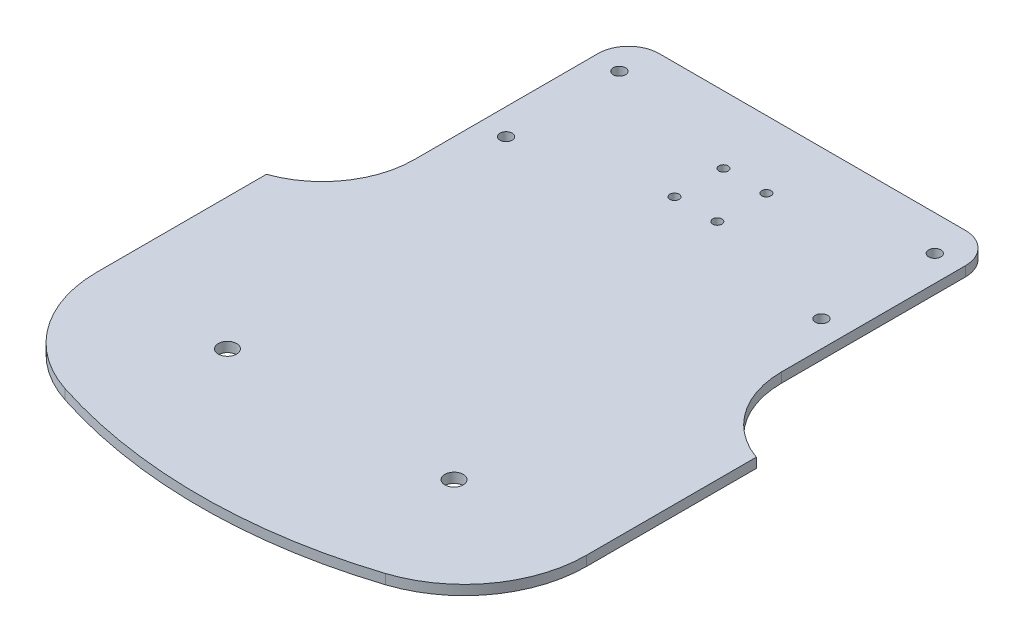
ISO-10303-21;
HEADER;
FILE_DESCRIPTION(('STEP AP214'),'2;1');
FILE_NAME('part.step','',(''),(''),'','','');
FILE_SCHEMA(('AUTOMOTIVE_DESIGN { 1 0 10303 214 1 1 1 1 }'));
ENDSEC;
DATA;
#1=APPLICATION_CONTEXT('core data for automotive mechanical design processes');
#2=APPLICATION_PROTOCOL_DEFINITION('international standard','automotive_design',2000,#1);
#3=PRODUCT_CONTEXT('',#1,'mechanical');
#4=PRODUCT('Part','Part','',(#3));
#5=PRODUCT_RELATED_PRODUCT_CATEGORY('part','',(#4));
#6=PRODUCT_DEFINITION_FORMATION('','',#4);
#7=PRODUCT_DEFINITION_CONTEXT('part definition',#1,'design');
#8=PRODUCT_DEFINITION('design','',#6,#7);
#9=PRODUCT_DEFINITION_SHAPE('','',#8);
#10=(LENGTH_UNIT() NAMED_UNIT(*) SI_UNIT(.MILLI.,.METRE.));
#11=(NAMED_UNIT(*) PLANE_ANGLE_UNIT() SI_UNIT($,.RADIAN.));
#12=(NAMED_UNIT(*) SI_UNIT($,.STERADIAN.) SOLID_ANGLE_UNIT());
#13=UNCERTAINTY_MEASURE_WITH_UNIT(LENGTH_MEASURE(1.E-05),#10,'distance_accuracy_value','');
#14=(GEOMETRIC_REPRESENTATION_CONTEXT(3) GLOBAL_UNCERTAINTY_ASSIGNED_CONTEXT((#13)) GLOBAL_UNIT_ASSIGNED_CONTEXT((#10,
#11,#12)) REPRESENTATION_CONTEXT('',''));
#15=CARTESIAN_POINT('',(0.,0.,0.));
#16=DIRECTION('',(0.,0.,1.));
#17=DIRECTION('',(1.,0.,0.));
#18=AXIS2_PLACEMENT_3D('',#15,#16,#17);
#19=CARTESIAN_POINT('',(20.,0.8,61.8465843842649));
#20=DIRECTION('',(0.,-1.,0.));
#21=DIRECTION('',(0.,0.,-1.));
#22=AXIS2_PLACEMENT_3D('',#19,#20,#21);
#23=CYLINDRICAL_SURFACE('',#22,20.);
#24=CARTESIAN_POINT('',(20.,-0.8,61.8465843842649));
#25=DIRECTION('',(0.,1.,0.));
#26=DIRECTION('',(0.,0.,-1.));
#27=AXIS2_PLACEMENT_3D('',#24,#25,#26);
#28=CIRCLE('',#27,20.);
#29=CARTESIAN_POINT('',(26.1538461538461,-0.8,80.8763026563464));
#30=VERTEX_POINT('',#29);
#31=CARTESIAN_POINT('',(40.,-0.8,61.8465843842649));
#32=VERTEX_POINT('',#31);
#33=EDGE_CURVE('E154',#30,#32,#28,.T.);
#34=ORIENTED_EDGE('',*,*,#33,.T.);
#35=DIRECTION('',(0.,-1.,0.));
#36=VECTOR('',#35,1.);
#37=CARTESIAN_POINT('',(40.,0.8,61.8465843842649));
#38=LINE('',#37,#36);
#39=CARTESIAN_POINT('',(40.,0.8,61.8465843842649));
#40=VERTEX_POINT('',#39);
#41=EDGE_CURVE('E11',#40,#32,#38,.T.);
#42=ORIENTED_EDGE('',*,*,#41,.F.);
#43=CARTESIAN_POINT('',(20.,0.8,61.8465843842649));
#44=DIRECTION('',(0.,1.,0.));
#45=DIRECTION('',(0.,0.,-1.));
#46=AXIS2_PLACEMENT_3D('',#43,#44,#45);
#47=CIRCLE('',#46,20.);
#48=CARTESIAN_POINT('',(26.1538461538461,0.8,80.8763026563464));
#49=VERTEX_POINT('',#48);
#50=EDGE_CURVE('E177',#49,#40,#47,.T.);
#51=ORIENTED_EDGE('',*,*,#50,.F.);
#52=DIRECTION('',(0.,-1.,0.));
#53=VECTOR('',#52,1.);
#54=CARTESIAN_POINT('',(26.1538461538461,0.8,80.8763026563464));
#55=LINE('',#54,#53);
#56=EDGE_CURVE('E150',#49,#30,#55,.T.);
#57=ORIENTED_EDGE('',*,*,#56,.T.);
#58=EDGE_LOOP('',(#34,#42,#51,#57));
#59=FACE_BOUND('',#58,.T.);
#60=ADVANCED_FACE('F34',(#59),#23,.T.);
#61=CARTESIAN_POINT('',(40.,0.8,61.8465843842649));
#62=DIRECTION('',(-1.,0.,0.));
#63=DIRECTION('',(0.,0.,1.));
#64=AXIS2_PLACEMENT_3D('',#61,#62,#63);
#65=PLANE('',#64);
#66=DIRECTION('',(0.,0.,-1.));
#67=VECTOR('',#66,1.);
#68=CARTESIAN_POINT('',(40.,-0.8,61.8465843842649));
#69=LINE('',#68,#67);
#70=CARTESIAN_POINT('',(40.,-0.8,34.142135623731));
#71=VERTEX_POINT('',#70);
#72=EDGE_CURVE('E157',#32,#71,#69,.T.);
#73=ORIENTED_EDGE('',*,*,#72,.T.);
#74=DIRECTION('',(0.,-1.,0.));
#75=VECTOR('',#74,1.);
#76=CARTESIAN_POINT('',(40.,0.8,34.142135623731));
#77=LINE('',#76,#75);
#78=CARTESIAN_POINT('',(40.,0.8,34.142135623731));
#79=VERTEX_POINT('',#78);
#80=EDGE_CURVE('E42',#79,#71,#77,.T.);
#81=ORIENTED_EDGE('',*,*,#80,.F.);
#82=DIRECTION('',(0.,0.,-1.));
#83=VECTOR('',#82,1.);
#84=CARTESIAN_POINT('',(40.,0.8,61.8465843842649));
#85=LINE('',#84,#83);
#86=EDGE_CURVE('E105',#40,#79,#85,.T.);
#87=ORIENTED_EDGE('',*,*,#86,.F.);
#88=ORIENTED_EDGE('',*,*,#41,.T.);
#89=EDGE_LOOP('',(#73,#81,#87,#88));
#90=FACE_BOUND('',#89,.T.);
#91=ADVANCED_FACE('F256',(#90),#65,.F.);
#92=CARTESIAN_POINT('',(45.,0.8,20.));
#93=DIRECTION('',(0.,-1.,0.));
#94=DIRECTION('',(0.,0.,-1.));
#95=AXIS2_PLACEMENT_3D('',#92,#93,#94);
#96=CYLINDRICAL_SURFACE('',#95,15.);
#97=CARTESIAN_POINT('',(45.,-0.8,20.));
#98=DIRECTION('',(0.,-1.,0.));
#99=DIRECTION('',(0.,0.,1.));
#100=AXIS2_PLACEMENT_3D('',#97,#98,#99);
#101=CIRCLE('',#100,15.);
#102=CARTESIAN_POINT('',(30.,-0.8,20.));
#103=VERTEX_POINT('',#102);
#104=EDGE_CURVE('E160',#71,#103,#101,.T.);
#105=ORIENTED_EDGE('',*,*,#104,.T.);
#106=DIRECTION('',(0.,-1.,0.));
#107=VECTOR('',#106,1.);
#108=CARTESIAN_POINT('',(30.,0.8,20.));
#109=LINE('',#108,#107);
#110=CARTESIAN_POINT('',(30.,0.8,20.));
#111=VERTEX_POINT('',#110);
#112=EDGE_CURVE('E196',#111,#103,#109,.T.);
#113=ORIENTED_EDGE('',*,*,#112,.F.);
#114=CARTESIAN_POINT('',(45.,0.8,20.));
#115=DIRECTION('',(0.,-1.,0.));
#116=DIRECTION('',(0.,0.,1.));
#117=AXIS2_PLACEMENT_3D('',#114,#115,#116);
#118=CIRCLE('',#117,15.);
#119=EDGE_CURVE('E204',#79,#111,#118,.T.);
#120=ORIENTED_EDGE('',*,*,#119,.F.);
#121=ORIENTED_EDGE('',*,*,#80,.T.);
#122=EDGE_LOOP('',(#105,#113,#120,#121));
#123=FACE_BOUND('',#122,.T.);
#124=ADVANCED_FACE('F202',(#123),#96,.F.);
#125=CARTESIAN_POINT('',(30.,0.8,-9.99999999999999));
#126=DIRECTION('',(-1.,0.,0.));
#127=DIRECTION('',(0.,0.,1.));
#128=AXIS2_PLACEMENT_3D('',#125,#126,#127);
#129=PLANE('',#128);
#130=DIRECTION('',(0.,0.,-1.));
#131=VECTOR('',#130,1.);
#132=CARTESIAN_POINT('',(30.,-0.8,-9.99999999999999));
#133=LINE('',#132,#131);
#134=CARTESIAN_POINT('',(30.,-0.8,-9.99999999999999));
#135=VERTEX_POINT('',#134);
#136=EDGE_CURVE('E162',#103,#135,#133,.T.);
#137=ORIENTED_EDGE('',*,*,#136,.T.);
#138=DIRECTION('',(0.,-1.,0.));
#139=VECTOR('',#138,1.);
#140=CARTESIAN_POINT('',(30.,0.8,-9.99999999999999));
#141=LINE('',#140,#139);
#142=CARTESIAN_POINT('',(30.,0.8,-9.99999999999999));
#143=VERTEX_POINT('',#142);
#144=EDGE_CURVE('E193',#143,#135,#141,.T.);
#145=ORIENTED_EDGE('',*,*,#144,.F.);
#146=DIRECTION('',(0.,0.,-1.));
#147=VECTOR('',#146,1.);
#148=CARTESIAN_POINT('',(30.,0.8,-9.99999999999999));
#149=LINE('',#148,#147);
#150=EDGE_CURVE('E222',#111,#143,#149,.T.);
#151=ORIENTED_EDGE('',*,*,#150,.F.);
#152=ORIENTED_EDGE('',*,*,#112,.T.);
#153=EDGE_LOOP('',(#137,#145,#151,#152));
#154=FACE_BOUND('',#153,.T.);
#155=ADVANCED_FACE('F213',(#154),#129,.F.);
#156=CARTESIAN_POINT('',(25.,0.8,-9.99999999999999));
#157=DIRECTION('',(0.,-1.,0.));
#158=DIRECTION('',(0.,0.,-1.));
#159=AXIS2_PLACEMENT_3D('',#156,#157,#158);
#160=CYLINDRICAL_SURFACE('',#159,5.);
#161=CARTESIAN_POINT('',(25.,-0.8,-9.99999999999999));
#162=DIRECTION('',(0.,1.,0.));
#163=DIRECTION('',(0.,0.,-1.));
#164=AXIS2_PLACEMENT_3D('',#161,#162,#163);
#165=CIRCLE('',#164,5.);
#166=CARTESIAN_POINT('',(25.,-0.8,-15.));
#167=VERTEX_POINT('',#166);
#168=EDGE_CURVE('E164',#135,#167,#165,.T.);
#169=ORIENTED_EDGE('',*,*,#168,.T.);
#170=DIRECTION('',(0.,-1.,0.));
#171=VECTOR('',#170,1.);
#172=CARTESIAN_POINT('',(25.,0.8,-15.));
#173=LINE('',#172,#171);
#174=CARTESIAN_POINT('',(25.,0.8,-15.));
#175=VERTEX_POINT('',#174);
#176=EDGE_CURVE('E190',#175,#167,#173,.T.);
#177=ORIENTED_EDGE('',*,*,#176,.F.);
#178=CARTESIAN_POINT('',(25.,0.8,-9.99999999999999));
#179=DIRECTION('',(0.,1.,0.));
#180=DIRECTION('',(0.,0.,-1.));
#181=AXIS2_PLACEMENT_3D('',#178,#179,#180);
#182=CIRCLE('',#181,5.);
#183=EDGE_CURVE('E219',#143,#175,#182,.T.);
#184=ORIENTED_EDGE('',*,*,#183,.F.);
#185=ORIENTED_EDGE('',*,*,#144,.T.);
#186=EDGE_LOOP('',(#169,#177,#184,#185));
#187=FACE_BOUND('',#186,.T.);
#188=ADVANCED_FACE('F217',(#187),#160,.T.);
#189=CARTESIAN_POINT('',(-25.,0.8,-15.));
#190=DIRECTION('',(0.,0.,1.));
#191=DIRECTION('',(1.,0.,0.));
#192=AXIS2_PLACEMENT_3D('',#189,#190,#191);
#193=PLANE('',#192);
#194=DIRECTION('',(-1.,0.,0.));
#195=VECTOR('',#194,1.);
#196=CARTESIAN_POINT('',(-25.,-0.8,-15.));
#197=LINE('',#196,#195);
#198=CARTESIAN_POINT('',(-25.,-0.8,-15.));
#199=VERTEX_POINT('',#198);
#200=EDGE_CURVE('E166',#167,#199,#197,.T.);
#201=ORIENTED_EDGE('',*,*,#200,.T.);
#202=DIRECTION('',(0.,-1.,0.));
#203=VECTOR('',#202,1.);
#204=CARTESIAN_POINT('',(-25.,0.8,-15.));
#205=LINE('',#204,#203);
#206=CARTESIAN_POINT('',(-25.,0.8,-15.));
#207=VERTEX_POINT('',#206);
#208=EDGE_CURVE('E187',#207,#199,#205,.T.);
#209=ORIENTED_EDGE('',*,*,#208,.F.);
#210=DIRECTION('',(-1.,0.,0.));
#211=VECTOR('',#210,1.);
#212=CARTESIAN_POINT('',(-25.,0.8,-15.));
#213=LINE('',#212,#211);
#214=EDGE_CURVE('E221',#175,#207,#213,.T.);
#215=ORIENTED_EDGE('',*,*,#214,.F.);
#216=ORIENTED_EDGE('',*,*,#176,.T.);
#217=EDGE_LOOP('',(#201,#209,#215,#216));
#218=FACE_BOUND('',#217,.T.);
#219=ADVANCED_FACE('F269',(#218),#193,.F.);
#220=CARTESIAN_POINT('',(-25.,0.8,-9.99999999999999));
#221=DIRECTION('',(0.,-1.,0.));
#222=DIRECTION('',(0.,0.,-1.));
#223=AXIS2_PLACEMENT_3D('',#220,#221,#222);
#224=CYLINDRICAL_SURFACE('',#223,5.);
#225=CARTESIAN_POINT('',(-25.,-0.8,-9.99999999999999));
#226=DIRECTION('',(0.,1.,0.));
#227=DIRECTION('',(0.,0.,1.));
#228=AXIS2_PLACEMENT_3D('',#225,#226,#227);
#229=CIRCLE('',#228,5.);
#230=CARTESIAN_POINT('',(-30.,-0.8,-10.));
#231=VERTEX_POINT('',#230);
#232=EDGE_CURVE('E168',#199,#231,#229,.T.);
#233=ORIENTED_EDGE('',*,*,#232,.T.);
#234=DIRECTION('',(0.,-1.,0.));
#235=VECTOR('',#234,1.);
#236=CARTESIAN_POINT('',(-30.,0.8,-10.));
#237=LINE('',#236,#235);
#238=CARTESIAN_POINT('',(-30.,0.8,-10.));
#239=VERTEX_POINT('',#238);
#240=EDGE_CURVE('E184',#239,#231,#237,.T.);
#241=ORIENTED_EDGE('',*,*,#240,.F.);
#242=CARTESIAN_POINT('',(-25.,0.8,-9.99999999999999));
#243=DIRECTION('',(0.,1.,0.));
#244=DIRECTION('',(0.,0.,1.));
#245=AXIS2_PLACEMENT_3D('',#242,#243,#244);
#246=CIRCLE('',#245,5.);
#247=EDGE_CURVE('E224',#207,#239,#246,.T.);
#248=ORIENTED_EDGE('',*,*,#247,.F.);
#249=ORIENTED_EDGE('',*,*,#208,.T.);
#250=EDGE_LOOP('',(#233,#241,#248,#249));
#251=FACE_BOUND('',#250,.T.);
#252=ADVANCED_FACE('F272',(#251),#224,.T.);
#253=CARTESIAN_POINT('',(-30.,0.8,-9.99999999999999));
#254=DIRECTION('',(1.,0.,0.));
#255=DIRECTION('',(0.,0.,-1.));
#256=AXIS2_PLACEMENT_3D('',#253,#254,#255);
#257=PLANE('',#256);
#258=DIRECTION('',(0.,0.,1.));
#259=VECTOR('',#258,1.);
#260=CARTESIAN_POINT('',(-30.,-0.8,-9.99999999999999));
#261=LINE('',#260,#259);
#262=CARTESIAN_POINT('',(-30.,-0.8,20.));
#263=VERTEX_POINT('',#262);
#264=EDGE_CURVE('E170',#231,#263,#261,.T.);
#265=ORIENTED_EDGE('',*,*,#264,.T.);
#266=DIRECTION('',(0.,-1.,0.));
#267=VECTOR('',#266,1.);
#268=CARTESIAN_POINT('',(-30.,0.8,20.));
#269=LINE('',#268,#267);
#270=CARTESIAN_POINT('',(-30.,0.8,20.));
#271=VERTEX_POINT('',#270);
#272=EDGE_CURVE('E181',#271,#263,#269,.T.);
#273=ORIENTED_EDGE('',*,*,#272,.F.);
#274=DIRECTION('',(0.,0.,1.));
#275=VECTOR('',#274,1.);
#276=CARTESIAN_POINT('',(-30.,0.8,-9.99999999999999));
#277=LINE('',#276,#275);
#278=EDGE_CURVE('E230',#239,#271,#277,.T.);
#279=ORIENTED_EDGE('',*,*,#278,.F.);
#280=ORIENTED_EDGE('',*,*,#240,.T.);
#281=EDGE_LOOP('',(#265,#273,#279,#280));
#282=FACE_BOUND('',#281,.T.);
#283=ADVANCED_FACE('F236',(#282),#257,.F.);
#284=CARTESIAN_POINT('',(-45.,0.8,20.));
#285=DIRECTION('',(0.,-1.,0.));
#286=DIRECTION('',(0.,0.,-1.));
#287=AXIS2_PLACEMENT_3D('',#284,#285,#286);
#288=CYLINDRICAL_SURFACE('',#287,15.);
#289=CARTESIAN_POINT('',(-45.,-0.8,20.));
#290=DIRECTION('',(0.,-1.,0.));
#291=DIRECTION('',(0.,0.,-1.));
#292=AXIS2_PLACEMENT_3D('',#289,#290,#291);
#293=CIRCLE('',#292,15.);
#294=CARTESIAN_POINT('',(-40.,-0.8,34.142135623731));
#295=VERTEX_POINT('',#294);
#296=EDGE_CURVE('E172',#263,#295,#293,.T.);
#297=ORIENTED_EDGE('',*,*,#296,.T.);
#298=DIRECTION('',(0.,-1.,0.));
#299=VECTOR('',#298,1.);
#300=CARTESIAN_POINT('',(-40.,0.8,34.142135623731));
#301=LINE('',#300,#299);
#302=CARTESIAN_POINT('',(-40.,0.8,34.142135623731));
#303=VERTEX_POINT('',#302);
#304=EDGE_CURVE('E145',#303,#295,#301,.T.);
#305=ORIENTED_EDGE('',*,*,#304,.F.);
#306=CARTESIAN_POINT('',(-45.,0.8,20.));
#307=DIRECTION('',(0.,-1.,0.));
#308=DIRECTION('',(0.,0.,-1.));
#309=AXIS2_PLACEMENT_3D('',#306,#307,#308);
#310=CIRCLE('',#309,15.);
#311=EDGE_CURVE('E136',#271,#303,#310,.T.);
#312=ORIENTED_EDGE('',*,*,#311,.F.);
#313=ORIENTED_EDGE('',*,*,#272,.T.);
#314=EDGE_LOOP('',(#297,#305,#312,#313));
#315=FACE_BOUND('',#314,.T.);
#316=ADVANCED_FACE('F240',(#315),#288,.F.);
#317=CARTESIAN_POINT('',(-40.,0.8,61.8465843842649));
#318=DIRECTION('',(1.,0.,0.));
#319=DIRECTION('',(0.,0.,-1.));
#320=AXIS2_PLACEMENT_3D('',#317,#318,#319);
#321=PLANE('',#320);
#322=DIRECTION('',(0.,0.,1.));
#323=VECTOR('',#322,1.);
#324=CARTESIAN_POINT('',(-40.,-0.8,61.8465843842649));
#325=LINE('',#324,#323);
#326=CARTESIAN_POINT('',(-40.,-0.8,61.8465843842649));
#327=VERTEX_POINT('',#326);
#328=EDGE_CURVE('E144',#295,#327,#325,.T.);
#329=ORIENTED_EDGE('',*,*,#328,.T.);
#330=DIRECTION('',(0.,-1.,0.));
#331=VECTOR('',#330,1.);
#332=CARTESIAN_POINT('',(-40.,0.8,61.8465843842649));
#333=LINE('',#332,#331);
#334=CARTESIAN_POINT('',(-40.,0.8,61.8465843842649));
#335=VERTEX_POINT('',#334);
#336=EDGE_CURVE('E141',#335,#327,#333,.T.);
#337=ORIENTED_EDGE('',*,*,#336,.F.);
#338=DIRECTION('',(0.,0.,1.));
#339=VECTOR('',#338,1.);
#340=CARTESIAN_POINT('',(-40.,0.8,61.8465843842649));
#341=LINE('',#340,#339);
#342=EDGE_CURVE('E130',#303,#335,#341,.T.);
#343=ORIENTED_EDGE('',*,*,#342,.F.);
#344=ORIENTED_EDGE('',*,*,#304,.T.);
#345=EDGE_LOOP('',(#329,#337,#343,#344));
#346=FACE_BOUND('',#345,.T.);
#347=ADVANCED_FACE('F142',(#346),#321,.F.);
#348=CARTESIAN_POINT('',(-20.,0.8,61.8465843842649));
#349=DIRECTION('',(0.,-1.,0.));
#350=DIRECTION('',(0.,0.,-1.));
#351=AXIS2_PLACEMENT_3D('',#348,#349,#350);
#352=CYLINDRICAL_SURFACE('',#351,20.);
#353=CARTESIAN_POINT('',(-20.,-0.8,61.8465843842649));
#354=DIRECTION('',(0.,1.,0.));
#355=DIRECTION('',(0.,0.,-1.));
#356=AXIS2_PLACEMENT_3D('',#353,#354,#355);
#357=CIRCLE('',#356,20.);
#358=CARTESIAN_POINT('',(-26.1538461538461,-0.8,80.8763026563464));
#359=VERTEX_POINT('',#358);
#360=EDGE_CURVE('E91',#327,#359,#357,.T.);
#361=ORIENTED_EDGE('',*,*,#360,.T.);
#362=DIRECTION('',(0.,-1.,0.));
#363=VECTOR('',#362,1.);
#364=CARTESIAN_POINT('',(-26.1538461538461,0.8,80.8763026563464));
#365=LINE('',#364,#363);
#366=CARTESIAN_POINT('',(-26.1538461538461,0.8,80.8763026563464));
#367=VERTEX_POINT('',#366);
#368=EDGE_CURVE('E146',#367,#359,#365,.T.);
#369=ORIENTED_EDGE('',*,*,#368,.F.);
#370=CARTESIAN_POINT('',(-20.,0.8,61.8465843842649));
#371=DIRECTION('',(0.,1.,0.));
#372=DIRECTION('',(0.,0.,-1.));
#373=AXIS2_PLACEMENT_3D('',#370,#371,#372);
#374=CIRCLE('',#373,20.);
#375=EDGE_CURVE('E134',#335,#367,#374,.T.);
#376=ORIENTED_EDGE('',*,*,#375,.F.);
#377=ORIENTED_EDGE('',*,*,#336,.T.);
#378=EDGE_LOOP('',(#361,#369,#376,#377));
#379=FACE_BOUND('',#378,.T.);
#380=ADVANCED_FACE('F148',(#379),#352,.T.);
#381=CARTESIAN_POINT('',(0.,0.8,0.));
#382=DIRECTION('',(0.,-1.,0.));
#383=DIRECTION('',(0.,0.,-1.));
#384=AXIS2_PLACEMENT_3D('',#381,#382,#383);
#385=CYLINDRICAL_SURFACE('',#384,85.);
#386=CARTESIAN_POINT('',(0.,-0.8,0.));
#387=DIRECTION('',(0.,1.,0.));
#388=DIRECTION('',(0.,0.,-1.));
#389=AXIS2_PLACEMENT_3D('',#386,#387,#388);
#390=CIRCLE('',#389,85.);
#391=EDGE_CURVE('E97',#359,#30,#390,.T.);
#392=ORIENTED_EDGE('',*,*,#391,.T.);
#393=ORIENTED_EDGE('',*,*,#56,.F.);
#394=CARTESIAN_POINT('',(0.,0.8,0.));
#395=DIRECTION('',(0.,1.,0.));
#396=DIRECTION('',(0.,0.,-1.));
#397=AXIS2_PLACEMENT_3D('',#394,#395,#396);
#398=CIRCLE('',#397,85.);
#399=EDGE_CURVE('E50',#367,#49,#398,.T.);
#400=ORIENTED_EDGE('',*,*,#399,.F.);
#401=ORIENTED_EDGE('',*,*,#368,.T.);
#402=EDGE_LOOP('',(#392,#393,#400,#401));
#403=FACE_BOUND('',#402,.T.);
#404=ADVANCED_FACE('F244',(#403),#385,.T.);
#405=CARTESIAN_POINT('',(20.,0.8,61.8465843842649));
#406=DIRECTION('',(0.,-1.,0.));
#407=DIRECTION('',(0.,0.,-1.));
#408=AXIS2_PLACEMENT_3D('',#405,#406,#407);
#409=PLANE('',#408);
#410=CARTESIAN_POINT('',(-18.5,0.8,62.0000000000001));
#411=DIRECTION('',(0.,-1.,0.));
#412=DIRECTION('',(0.,0.,-1.));
#413=AXIS2_PLACEMENT_3D('',#410,#411,#412);
#414=CIRCLE('',#413,1.5);
#415=CARTESIAN_POINT('',(-18.5,0.8,60.5000000000001));
#416=VERTEX_POINT('',#415);
#417=EDGE_CURVE('E416',#416,#416,#414,.T.);
#418=ORIENTED_EDGE('',*,*,#417,.T.);
#419=EDGE_LOOP('',(#418));
#420=FACE_BOUND('',#419,.T.);
#421=CARTESIAN_POINT('',(18.5,0.8,62.0000000000001));
#422=DIRECTION('',(0.,-1.,0.));
#423=DIRECTION('',(0.,0.,-1.));
#424=AXIS2_PLACEMENT_3D('',#421,#422,#423);
#425=CIRCLE('',#424,1.49999999999999);
#426=CARTESIAN_POINT('',(18.5,0.8,60.5000000000001));
#427=VERTEX_POINT('',#426);
#428=EDGE_CURVE('E424',#427,#427,#425,.T.);
#429=ORIENTED_EDGE('',*,*,#428,.T.);
#430=EDGE_LOOP('',(#429));
#431=FACE_BOUND('',#430,.T.);
#432=CARTESIAN_POINT('',(3.5,0.8,-4.));
#433=DIRECTION('',(0.,-1.,0.));
#434=DIRECTION('',(0.,0.,-1.));
#435=AXIS2_PLACEMENT_3D('',#432,#433,#434);
#436=CIRCLE('',#435,0.750000000000001);
#437=CARTESIAN_POINT('',(3.5,0.8,-4.75));
#438=VERTEX_POINT('',#437);
#439=EDGE_CURVE('E430',#438,#438,#436,.T.);
#440=ORIENTED_EDGE('',*,*,#439,.T.);
#441=EDGE_LOOP('',(#440));
#442=FACE_BOUND('',#441,.T.);
#443=CARTESIAN_POINT('',(-3.5,0.8,-4.));
#444=DIRECTION('',(0.,-1.,0.));
#445=DIRECTION('',(0.,0.,-1.));
#446=AXIS2_PLACEMENT_3D('',#443,#444,#445);
#447=CIRCLE('',#446,0.75);
#448=CARTESIAN_POINT('',(-3.5,0.8,-4.75));
#449=VERTEX_POINT('',#448);
#450=EDGE_CURVE('E436',#449,#449,#447,.T.);
#451=ORIENTED_EDGE('',*,*,#450,.T.);
#452=EDGE_LOOP('',(#451));
#453=FACE_BOUND('',#452,.T.);
#454=CARTESIAN_POINT('',(3.5,0.8,4.));
#455=DIRECTION('',(0.,-1.,0.));
#456=DIRECTION('',(0.,0.,-1.));
#457=AXIS2_PLACEMENT_3D('',#454,#455,#456);
#458=CIRCLE('',#457,0.750000000000001);
#459=CARTESIAN_POINT('',(3.5,0.8,3.25));
#460=VERTEX_POINT('',#459);
#461=EDGE_CURVE('E442',#460,#460,#458,.T.);
#462=ORIENTED_EDGE('',*,*,#461,.T.);
#463=EDGE_LOOP('',(#462));
#464=FACE_BOUND('',#463,.T.);
#465=CARTESIAN_POINT('',(-3.5,0.8,4.));
#466=DIRECTION('',(0.,-1.,0.));
#467=DIRECTION('',(0.,0.,-1.));
#468=AXIS2_PLACEMENT_3D('',#465,#466,#467);
#469=CIRCLE('',#468,0.75);
#470=CARTESIAN_POINT('',(-3.5,0.8,3.25));
#471=VERTEX_POINT('',#470);
#472=EDGE_CURVE('E448',#471,#471,#469,.T.);
#473=ORIENTED_EDGE('',*,*,#472,.T.);
#474=EDGE_LOOP('',(#473));
#475=FACE_BOUND('',#474,.T.);
#476=CARTESIAN_POINT('',(25.75,0.8,-9.24999999999997));
#477=DIRECTION('',(0.,-1.,0.));
#478=DIRECTION('',(0.,0.,-1.));
#479=AXIS2_PLACEMENT_3D('',#476,#477,#478);
#480=CIRCLE('',#479,0.999999999999998);
#481=CARTESIAN_POINT('',(25.75,0.8,-10.25));
#482=VERTEX_POINT('',#481);
#483=EDGE_CURVE('E454',#482,#482,#480,.T.);
#484=ORIENTED_EDGE('',*,*,#483,.T.);
#485=EDGE_LOOP('',(#484));
#486=FACE_BOUND('',#485,.T.);
#487=CARTESIAN_POINT('',(25.75,0.8,9.25000000000003));
#488=DIRECTION('',(0.,-1.,0.));
#489=DIRECTION('',(0.,0.,-1.));
#490=AXIS2_PLACEMENT_3D('',#487,#488,#489);
#491=CIRCLE('',#490,1.);
#492=CARTESIAN_POINT('',(25.75,0.8,8.25000000000002));
#493=VERTEX_POINT('',#492);
#494=EDGE_CURVE('E460',#493,#493,#491,.T.);
#495=ORIENTED_EDGE('',*,*,#494,.T.);
#496=EDGE_LOOP('',(#495));
#497=FACE_BOUND('',#496,.T.);
#498=CARTESIAN_POINT('',(-25.75,0.8,9.25));
#499=DIRECTION('',(0.,-1.,0.));
#500=DIRECTION('',(0.,0.,-1.));
#501=AXIS2_PLACEMENT_3D('',#498,#499,#500);
#502=CIRCLE('',#501,1.);
#503=CARTESIAN_POINT('',(-25.75,0.8,8.25));
#504=VERTEX_POINT('',#503);
#505=EDGE_CURVE('E466',#504,#504,#502,.T.);
#506=ORIENTED_EDGE('',*,*,#505,.T.);
#507=EDGE_LOOP('',(#506));
#508=FACE_BOUND('',#507,.T.);
#509=CARTESIAN_POINT('',(-25.75,0.8,-9.25));
#510=DIRECTION('',(0.,-1.,0.));
#511=DIRECTION('',(0.,0.,-1.));
#512=AXIS2_PLACEMENT_3D('',#509,#510,#511);
#513=CIRCLE('',#512,1.);
#514=CARTESIAN_POINT('',(-25.75,0.8,-10.25));
#515=VERTEX_POINT('',#514);
#516=EDGE_CURVE('E158',#515,#515,#513,.T.);
#517=ORIENTED_EDGE('',*,*,#516,.T.);
#518=EDGE_LOOP('',(#517));
#519=FACE_BOUND('',#518,.T.);
#520=ORIENTED_EDGE('',*,*,#50,.T.);
#521=ORIENTED_EDGE('',*,*,#86,.T.);
#522=ORIENTED_EDGE('',*,*,#119,.T.);
#523=ORIENTED_EDGE('',*,*,#150,.T.);
#524=ORIENTED_EDGE('',*,*,#183,.T.);
#525=ORIENTED_EDGE('',*,*,#214,.T.);
#526=ORIENTED_EDGE('',*,*,#247,.T.);
#527=ORIENTED_EDGE('',*,*,#278,.T.);
#528=ORIENTED_EDGE('',*,*,#311,.T.);
#529=ORIENTED_EDGE('',*,*,#342,.T.);
#530=ORIENTED_EDGE('',*,*,#375,.T.);
#531=ORIENTED_EDGE('',*,*,#399,.T.);
#532=EDGE_LOOP('',(#520,#521,#522,#523,#524,#525,#526,#527,#528,#529,#530,#531));
#533=FACE_BOUND('',#532,.T.);
#534=ADVANCED_FACE('F132',(#420,#431,#442,#453,#464,#475,#486,#497,#508,#519,#533),#409,.F.);
#535=CARTESIAN_POINT('',(20.,-0.8,61.8465843842649));
#536=DIRECTION('',(0.,-1.,0.));
#537=DIRECTION('',(0.,0.,-1.));
#538=AXIS2_PLACEMENT_3D('',#535,#536,#537);
#539=PLANE('',#538);
#540=CARTESIAN_POINT('',(-18.5,-0.8,62.0000000000001));
#541=DIRECTION('',(0.,-1.,0.));
#542=DIRECTION('',(0.,0.,-1.));
#543=AXIS2_PLACEMENT_3D('',#540,#541,#542);
#544=CIRCLE('',#543,1.5);
#545=CARTESIAN_POINT('',(-18.5,-0.8,60.5000000000001));
#546=VERTEX_POINT('',#545);
#547=EDGE_CURVE('E419',#546,#546,#544,.T.);
#548=ORIENTED_EDGE('',*,*,#547,.F.);
#549=EDGE_LOOP('',(#548));
#550=FACE_BOUND('',#549,.T.);
#551=CARTESIAN_POINT('',(18.5,-0.8,62.0000000000001));
#552=DIRECTION('',(0.,-1.,0.));
#553=DIRECTION('',(0.,0.,-1.));
#554=AXIS2_PLACEMENT_3D('',#551,#552,#553);
#555=CIRCLE('',#554,1.49999999999999);
#556=CARTESIAN_POINT('',(18.5,-0.8,60.5000000000001));
#557=VERTEX_POINT('',#556);
#558=EDGE_CURVE('E421',#557,#557,#555,.T.);
#559=ORIENTED_EDGE('',*,*,#558,.F.);
#560=EDGE_LOOP('',(#559));
#561=FACE_BOUND('',#560,.T.);
#562=CARTESIAN_POINT('',(3.5,-0.8,-4.));
#563=DIRECTION('',(0.,-1.,0.));
#564=DIRECTION('',(0.,0.,-1.));
#565=AXIS2_PLACEMENT_3D('',#562,#563,#564);
#566=CIRCLE('',#565,0.750000000000001);
#567=CARTESIAN_POINT('',(3.5,-0.8,-4.75));
#568=VERTEX_POINT('',#567);
#569=EDGE_CURVE('E427',#568,#568,#566,.T.);
#570=ORIENTED_EDGE('',*,*,#569,.F.);
#571=EDGE_LOOP('',(#570));
#572=FACE_BOUND('',#571,.T.);
#573=CARTESIAN_POINT('',(-3.5,-0.8,-4.));
#574=DIRECTION('',(0.,-1.,0.));
#575=DIRECTION('',(0.,0.,-1.));
#576=AXIS2_PLACEMENT_3D('',#573,#574,#575);
#577=CIRCLE('',#576,0.75);
#578=CARTESIAN_POINT('',(-3.5,-0.8,-4.75));
#579=VERTEX_POINT('',#578);
#580=EDGE_CURVE('E433',#579,#579,#577,.T.);
#581=ORIENTED_EDGE('',*,*,#580,.F.);
#582=EDGE_LOOP('',(#581));
#583=FACE_BOUND('',#582,.T.);
#584=CARTESIAN_POINT('',(3.5,-0.8,4.));
#585=DIRECTION('',(0.,-1.,0.));
#586=DIRECTION('',(0.,0.,-1.));
#587=AXIS2_PLACEMENT_3D('',#584,#585,#586);
#588=CIRCLE('',#587,0.750000000000001);
#589=CARTESIAN_POINT('',(3.5,-0.8,3.25));
#590=VERTEX_POINT('',#589);
#591=EDGE_CURVE('E439',#590,#590,#588,.T.);
#592=ORIENTED_EDGE('',*,*,#591,.F.);
#593=EDGE_LOOP('',(#592));
#594=FACE_BOUND('',#593,.T.);
#595=CARTESIAN_POINT('',(-3.5,-0.8,4.));
#596=DIRECTION('',(0.,-1.,0.));
#597=DIRECTION('',(0.,0.,-1.));
#598=AXIS2_PLACEMENT_3D('',#595,#596,#597);
#599=CIRCLE('',#598,0.75);
#600=CARTESIAN_POINT('',(-3.5,-0.8,3.25));
#601=VERTEX_POINT('',#600);
#602=EDGE_CURVE('E445',#601,#601,#599,.T.);
#603=ORIENTED_EDGE('',*,*,#602,.F.);
#604=EDGE_LOOP('',(#603));
#605=FACE_BOUND('',#604,.T.);
#606=CARTESIAN_POINT('',(25.75,-0.8,-9.24999999999997));
#607=DIRECTION('',(0.,-1.,0.));
#608=DIRECTION('',(0.,0.,-1.));
#609=AXIS2_PLACEMENT_3D('',#606,#607,#608);
#610=CIRCLE('',#609,0.999999999999998);
#611=CARTESIAN_POINT('',(25.75,-0.8,-10.25));
#612=VERTEX_POINT('',#611);
#613=EDGE_CURVE('E451',#612,#612,#610,.T.);
#614=ORIENTED_EDGE('',*,*,#613,.F.);
#615=EDGE_LOOP('',(#614));
#616=FACE_BOUND('',#615,.T.);
#617=CARTESIAN_POINT('',(25.75,-0.8,9.25000000000003));
#618=DIRECTION('',(0.,-1.,0.));
#619=DIRECTION('',(0.,0.,-1.));
#620=AXIS2_PLACEMENT_3D('',#617,#618,#619);
#621=CIRCLE('',#620,1.);
#622=CARTESIAN_POINT('',(25.75,-0.8,8.25000000000002));
#623=VERTEX_POINT('',#622);
#624=EDGE_CURVE('E457',#623,#623,#621,.T.);
#625=ORIENTED_EDGE('',*,*,#624,.F.);
#626=EDGE_LOOP('',(#625));
#627=FACE_BOUND('',#626,.T.);
#628=CARTESIAN_POINT('',(-25.75,-0.8,9.25));
#629=DIRECTION('',(0.,-1.,0.));
#630=DIRECTION('',(0.,0.,-1.));
#631=AXIS2_PLACEMENT_3D('',#628,#629,#630);
#632=CIRCLE('',#631,1.);
#633=CARTESIAN_POINT('',(-25.75,-0.8,8.25));
#634=VERTEX_POINT('',#633);
#635=EDGE_CURVE('E463',#634,#634,#632,.T.);
#636=ORIENTED_EDGE('',*,*,#635,.F.);
#637=EDGE_LOOP('',(#636));
#638=FACE_BOUND('',#637,.T.);
#639=CARTESIAN_POINT('',(-25.75,-0.8,-9.25));
#640=DIRECTION('',(0.,-1.,0.));
#641=DIRECTION('',(0.,0.,-1.));
#642=AXIS2_PLACEMENT_3D('',#639,#640,#641);
#643=CIRCLE('',#642,1.);
#644=CARTESIAN_POINT('',(-25.75,-0.8,-10.25));
#645=VERTEX_POINT('',#644);
#646=EDGE_CURVE('E469',#645,#645,#643,.T.);
#647=ORIENTED_EDGE('',*,*,#646,.F.);
#648=EDGE_LOOP('',(#647));
#649=FACE_BOUND('',#648,.T.);
#650=ORIENTED_EDGE('',*,*,#33,.F.);
#651=ORIENTED_EDGE('',*,*,#391,.F.);
#652=ORIENTED_EDGE('',*,*,#360,.F.);
#653=ORIENTED_EDGE('',*,*,#328,.F.);
#654=ORIENTED_EDGE('',*,*,#296,.F.);
#655=ORIENTED_EDGE('',*,*,#264,.F.);
#656=ORIENTED_EDGE('',*,*,#232,.F.);
#657=ORIENTED_EDGE('',*,*,#200,.F.);
#658=ORIENTED_EDGE('',*,*,#168,.F.);
#659=ORIENTED_EDGE('',*,*,#136,.F.);
#660=ORIENTED_EDGE('',*,*,#104,.F.);
#661=ORIENTED_EDGE('',*,*,#72,.F.);
#662=EDGE_LOOP('',(#650,#651,#652,#653,#654,#655,#656,#657,#658,#659,#660,#661));
#663=FACE_BOUND('',#662,.T.);
#664=ADVANCED_FACE('F208',(#550,#561,#572,#583,#594,#605,#616,#627,#638,#649,#663),#539,.T.);
#665=CARTESIAN_POINT('',(-25.75,0.8,-9.25));
#666=DIRECTION('',(0.,-1.,0.));
#667=DIRECTION('',(0.,0.,-1.));
#668=AXIS2_PLACEMENT_3D('',#665,#666,#667);
#669=CYLINDRICAL_SURFACE('',#668,1.);
#670=ORIENTED_EDGE('',*,*,#516,.F.);
#671=EDGE_LOOP('',(#670));
#672=FACE_BOUND('',#671,.T.);
#673=ORIENTED_EDGE('',*,*,#646,.T.);
#674=EDGE_LOOP('',(#673));
#675=FACE_BOUND('',#674,.T.);
#676=ADVANCED_FACE('F300',(#672,#675),#669,.F.);
#677=CARTESIAN_POINT('',(-25.75,0.8,9.25));
#678=DIRECTION('',(0.,-1.,0.));
#679=DIRECTION('',(0.,0.,-1.));
#680=AXIS2_PLACEMENT_3D('',#677,#678,#679);
#681=CYLINDRICAL_SURFACE('',#680,1.);
#682=ORIENTED_EDGE('',*,*,#505,.F.);
#683=EDGE_LOOP('',(#682));
#684=FACE_BOUND('',#683,.T.);
#685=ORIENTED_EDGE('',*,*,#635,.T.);
#686=EDGE_LOOP('',(#685));
#687=FACE_BOUND('',#686,.T.);
#688=ADVANCED_FACE('F305',(#684,#687),#681,.F.);
#689=CARTESIAN_POINT('',(25.75,0.8,9.25000000000003));
#690=DIRECTION('',(0.,-1.,0.));
#691=DIRECTION('',(0.,0.,-1.));
#692=AXIS2_PLACEMENT_3D('',#689,#690,#691);
#693=CYLINDRICAL_SURFACE('',#692,1.);
#694=ORIENTED_EDGE('',*,*,#494,.F.);
#695=EDGE_LOOP('',(#694));
#696=FACE_BOUND('',#695,.T.);
#697=ORIENTED_EDGE('',*,*,#624,.T.);
#698=EDGE_LOOP('',(#697));
#699=FACE_BOUND('',#698,.T.);
#700=ADVANCED_FACE('F317',(#696,#699),#693,.F.);
#701=CARTESIAN_POINT('',(25.75,0.8,-9.24999999999997));
#702=DIRECTION('',(0.,-1.,0.));
#703=DIRECTION('',(0.,0.,-1.));
#704=AXIS2_PLACEMENT_3D('',#701,#702,#703);
#705=CYLINDRICAL_SURFACE('',#704,0.999999999999998);
#706=ORIENTED_EDGE('',*,*,#483,.F.);
#707=EDGE_LOOP('',(#706));
#708=FACE_BOUND('',#707,.T.);
#709=ORIENTED_EDGE('',*,*,#613,.T.);
#710=EDGE_LOOP('',(#709));
#711=FACE_BOUND('',#710,.T.);
#712=ADVANCED_FACE('F327',(#708,#711),#705,.F.);
#713=CARTESIAN_POINT('',(-3.5,0.8,4.));
#714=DIRECTION('',(0.,-1.,0.));
#715=DIRECTION('',(0.,0.,-1.));
#716=AXIS2_PLACEMENT_3D('',#713,#714,#715);
#717=CYLINDRICAL_SURFACE('',#716,0.75);
#718=ORIENTED_EDGE('',*,*,#472,.F.);
#719=EDGE_LOOP('',(#718));
#720=FACE_BOUND('',#719,.T.);
#721=ORIENTED_EDGE('',*,*,#602,.T.);
#722=EDGE_LOOP('',(#721));
#723=FACE_BOUND('',#722,.T.);
#724=ADVANCED_FACE('F337',(#720,#723),#717,.F.);
#725=CARTESIAN_POINT('',(3.5,0.8,4.));
#726=DIRECTION('',(0.,-1.,0.));
#727=DIRECTION('',(0.,0.,-1.));
#728=AXIS2_PLACEMENT_3D('',#725,#726,#727);
#729=CYLINDRICAL_SURFACE('',#728,0.750000000000001);
#730=ORIENTED_EDGE('',*,*,#461,.F.);
#731=EDGE_LOOP('',(#730));
#732=FACE_BOUND('',#731,.T.);
#733=ORIENTED_EDGE('',*,*,#591,.T.);
#734=EDGE_LOOP('',(#733));
#735=FACE_BOUND('',#734,.T.);
#736=ADVANCED_FACE('F347',(#732,#735),#729,.F.);
#737=CARTESIAN_POINT('',(-3.5,0.8,-4.));
#738=DIRECTION('',(0.,-1.,0.));
#739=DIRECTION('',(0.,0.,-1.));
#740=AXIS2_PLACEMENT_3D('',#737,#738,#739);
#741=CYLINDRICAL_SURFACE('',#740,0.75);
#742=ORIENTED_EDGE('',*,*,#450,.F.);
#743=EDGE_LOOP('',(#742));
#744=FACE_BOUND('',#743,.T.);
#745=ORIENTED_EDGE('',*,*,#580,.T.);
#746=EDGE_LOOP('',(#745));
#747=FACE_BOUND('',#746,.T.);
#748=ADVANCED_FACE('F357',(#744,#747),#741,.F.);
#749=CARTESIAN_POINT('',(3.5,0.8,-4.));
#750=DIRECTION('',(0.,-1.,0.));
#751=DIRECTION('',(0.,0.,-1.));
#752=AXIS2_PLACEMENT_3D('',#749,#750,#751);
#753=CYLINDRICAL_SURFACE('',#752,0.750000000000001);
#754=ORIENTED_EDGE('',*,*,#439,.F.);
#755=EDGE_LOOP('',(#754));
#756=FACE_BOUND('',#755,.T.);
#757=ORIENTED_EDGE('',*,*,#569,.T.);
#758=EDGE_LOOP('',(#757));
#759=FACE_BOUND('',#758,.T.);
#760=ADVANCED_FACE('F367',(#756,#759),#753,.F.);
#761=CARTESIAN_POINT('',(18.5,0.8,62.0000000000001));
#762=DIRECTION('',(0.,-1.,0.));
#763=DIRECTION('',(0.,0.,-1.));
#764=AXIS2_PLACEMENT_3D('',#761,#762,#763);
#765=CYLINDRICAL_SURFACE('',#764,1.49999999999999);
#766=ORIENTED_EDGE('',*,*,#428,.F.);
#767=EDGE_LOOP('',(#766));
#768=FACE_BOUND('',#767,.T.);
#769=ORIENTED_EDGE('',*,*,#558,.T.);
#770=EDGE_LOOP('',(#769));
#771=FACE_BOUND('',#770,.T.);
#772=ADVANCED_FACE('F377',(#768,#771),#765,.F.);
#773=CARTESIAN_POINT('',(-18.5,0.8,62.0000000000001));
#774=DIRECTION('',(0.,-1.,0.));
#775=DIRECTION('',(0.,0.,-1.));
#776=AXIS2_PLACEMENT_3D('',#773,#774,#775);
#777=CYLINDRICAL_SURFACE('',#776,1.5);
#778=ORIENTED_EDGE('',*,*,#417,.F.);
#779=EDGE_LOOP('',(#778));
#780=FACE_BOUND('',#779,.T.);
#781=ORIENTED_EDGE('',*,*,#547,.T.);
#782=EDGE_LOOP('',(#781));
#783=FACE_BOUND('',#782,.T.);
#784=ADVANCED_FACE('F399',(#780,#783),#777,.F.);
#785=CLOSED_SHELL('',(#60,#91,#124,#155,#188,#219,#252,#283,#316,#347,#380,#404,#534,#664,#676,
#688,#700,#712,#724,#736,#748,#760,#772,#784));
#786=MANIFOLD_SOLID_BREP('B2',#785);
#787=ADVANCED_BREP_SHAPE_REPRESENTATION('',(#18,#786),#14);
#788=SHAPE_DEFINITION_REPRESENTATION(#9,#787);
ENDSEC;
END-ISO-10303-21;
